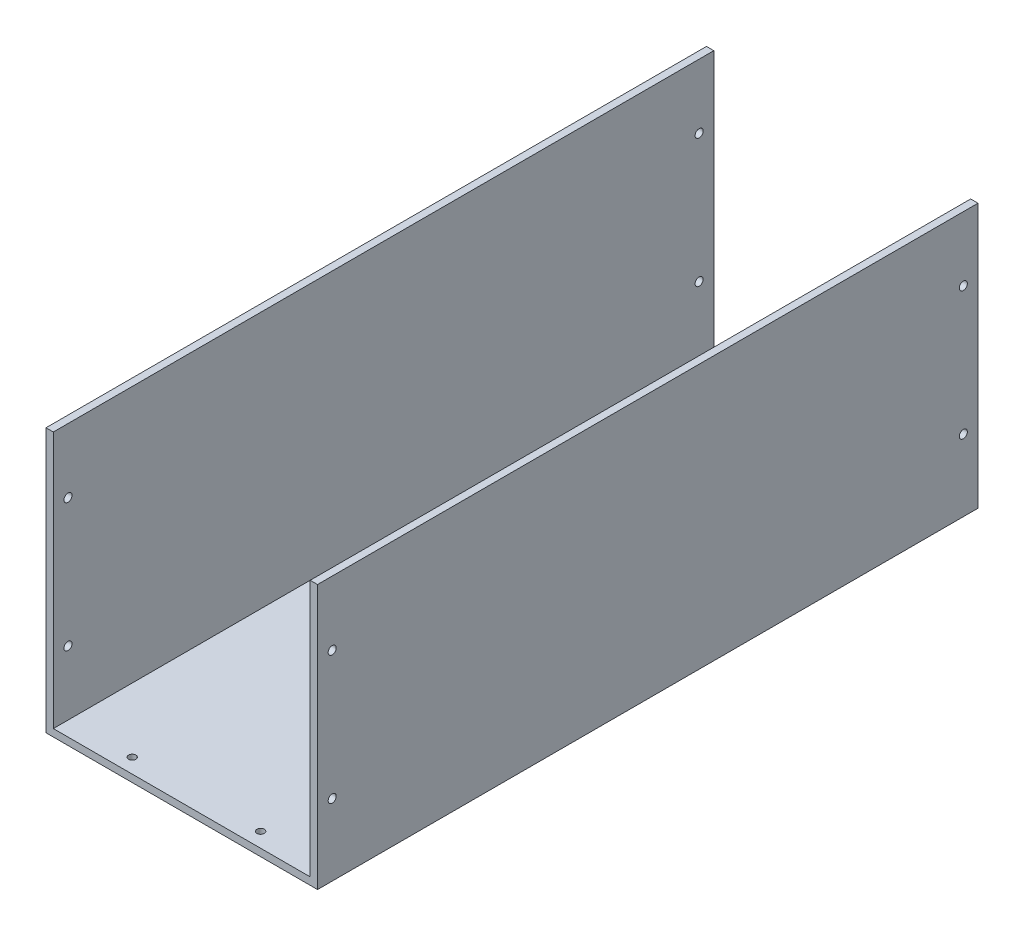
ISO-10303-21;
HEADER;
FILE_DESCRIPTION(('STEP AP214'),'2;1');
FILE_NAME('part.step','',(''),(''),'','','');
FILE_SCHEMA(('AUTOMOTIVE_DESIGN { 1 0 10303 214 1 1 1 1 }'));
ENDSEC;
DATA;
#1=APPLICATION_CONTEXT('core data for automotive mechanical design processes');
#2=APPLICATION_PROTOCOL_DEFINITION('international standard','automotive_design',2000,#1);
#3=PRODUCT_CONTEXT('',#1,'mechanical');
#4=PRODUCT('Part','Part','',(#3));
#5=PRODUCT_RELATED_PRODUCT_CATEGORY('part','',(#4));
#6=PRODUCT_DEFINITION_FORMATION('','',#4);
#7=PRODUCT_DEFINITION_CONTEXT('part definition',#1,'design');
#8=PRODUCT_DEFINITION('design','',#6,#7);
#9=PRODUCT_DEFINITION_SHAPE('','',#8);
#10=(LENGTH_UNIT() NAMED_UNIT(*) SI_UNIT(.MILLI.,.METRE.));
#11=(NAMED_UNIT(*) PLANE_ANGLE_UNIT() SI_UNIT($,.RADIAN.));
#12=(NAMED_UNIT(*) SI_UNIT($,.STERADIAN.) SOLID_ANGLE_UNIT());
#13=UNCERTAINTY_MEASURE_WITH_UNIT(LENGTH_MEASURE(1.E-05),#10,'distance_accuracy_value','');
#14=(GEOMETRIC_REPRESENTATION_CONTEXT(3) GLOBAL_UNCERTAINTY_ASSIGNED_CONTEXT((#13)) GLOBAL_UNIT_ASSIGNED_CONTEXT((#10,
#11,#12)) REPRESENTATION_CONTEXT('',''));
#15=CARTESIAN_POINT('',(0.,0.,0.));
#16=DIRECTION('',(0.,0.,1.));
#17=DIRECTION('',(1.,0.,0.));
#18=AXIS2_PLACEMENT_3D('',#15,#16,#17);
#19=CARTESIAN_POINT('',(-35.,0.,180.));
#20=DIRECTION('',(-1.,0.,0.));
#21=DIRECTION('',(0.,-1.,0.));
#22=AXIS2_PLACEMENT_3D('',#19,#20,#21);
#23=PLANE('',#22);
#24=CARTESIAN_POINT('',(-35.,52.5,176.));
#25=DIRECTION('',(-1.,0.,0.));
#26=DIRECTION('',(0.,-1.,0.));
#27=AXIS2_PLACEMENT_3D('',#24,#25,#26);
#28=CIRCLE('',#27,1.1);
#29=CARTESIAN_POINT('',(-35.,51.4,176.));
#30=VERTEX_POINT('',#29);
#31=EDGE_CURVE('E195',#30,#30,#28,.F.);
#32=ORIENTED_EDGE('',*,*,#31,.F.);
#33=EDGE_LOOP('',(#32));
#34=FACE_BOUND('',#33,.T.);
#35=CARTESIAN_POINT('',(-35.,17.5,176.));
#36=DIRECTION('',(-1.,0.,0.));
#37=DIRECTION('',(0.,-1.,0.));
#38=AXIS2_PLACEMENT_3D('',#35,#36,#37);
#39=CIRCLE('',#38,1.1);
#40=CARTESIAN_POINT('',(-35.,16.4,176.));
#41=VERTEX_POINT('',#40);
#42=EDGE_CURVE('E171',#41,#41,#39,.F.);
#43=ORIENTED_EDGE('',*,*,#42,.F.);
#44=EDGE_LOOP('',(#43));
#45=FACE_BOUND('',#44,.T.);
#46=CARTESIAN_POINT('',(-35.,52.5,4.));
#47=DIRECTION('',(-1.,0.,0.));
#48=DIRECTION('',(0.,-1.,0.));
#49=AXIS2_PLACEMENT_3D('',#46,#47,#48);
#50=CIRCLE('',#49,1.1);
#51=CARTESIAN_POINT('',(-35.,51.4,4.));
#52=VERTEX_POINT('',#51);
#53=EDGE_CURVE('E139',#52,#52,#50,.T.);
#54=ORIENTED_EDGE('',*,*,#53,.T.);
#55=EDGE_LOOP('',(#54));
#56=FACE_BOUND('',#55,.T.);
#57=CARTESIAN_POINT('',(-35.,17.5,4.));
#58=DIRECTION('',(-1.,0.,0.));
#59=DIRECTION('',(0.,-1.,0.));
#60=AXIS2_PLACEMENT_3D('',#57,#58,#59);
#61=CIRCLE('',#60,1.1);
#62=CARTESIAN_POINT('',(-35.,16.4,4.));
#63=VERTEX_POINT('',#62);
#64=EDGE_CURVE('E165',#63,#63,#61,.T.);
#65=ORIENTED_EDGE('',*,*,#64,.T.);
#66=EDGE_LOOP('',(#65));
#67=FACE_BOUND('',#66,.T.);
#68=DIRECTION('',(0.,1.,0.));
#69=VECTOR('',#68,1.);
#70=CARTESIAN_POINT('',(-35.,0.,0.));
#71=LINE('',#70,#69);
#72=CARTESIAN_POINT('',(-35.,0.,0.));
#73=VERTEX_POINT('',#72);
#74=CARTESIAN_POINT('',(-35.,70.,0.));
#75=VERTEX_POINT('',#74);
#76=EDGE_CURVE('E135',#73,#75,#71,.T.);
#77=ORIENTED_EDGE('',*,*,#76,.T.);
#78=DIRECTION('',(0.,0.,-1.));
#79=VECTOR('',#78,1.);
#80=CARTESIAN_POINT('',(-35.,70.,180.));
#81=LINE('',#80,#79);
#82=CARTESIAN_POINT('',(-35.,70.,180.));
#83=VERTEX_POINT('',#82);
#84=EDGE_CURVE('E11',#83,#75,#81,.T.);
#85=ORIENTED_EDGE('',*,*,#84,.F.);
#86=DIRECTION('',(0.,1.,0.));
#87=VECTOR('',#86,1.);
#88=CARTESIAN_POINT('',(-35.,0.,180.));
#89=LINE('',#88,#87);
#90=CARTESIAN_POINT('',(-35.,0.,180.));
#91=VERTEX_POINT('',#90);
#92=EDGE_CURVE('E150',#91,#83,#89,.T.);
#93=ORIENTED_EDGE('',*,*,#92,.F.);
#94=DIRECTION('',(0.,0.,-1.));
#95=VECTOR('',#94,1.);
#96=CARTESIAN_POINT('',(-35.,0.,180.));
#97=LINE('',#96,#95);
#98=EDGE_CURVE('E131',#91,#73,#97,.T.);
#99=ORIENTED_EDGE('',*,*,#98,.T.);
#100=EDGE_LOOP('',(#77,#85,#93,#99));
#101=FACE_BOUND('',#100,.T.);
#102=ADVANCED_FACE('F37',(#34,#45,#56,#67,#101),#23,.F.);
#103=CARTESIAN_POINT('',(-37.,70.,180.));
#104=DIRECTION('',(0.,-1.,0.));
#105=DIRECTION('',(0.,0.,-1.));
#106=AXIS2_PLACEMENT_3D('',#103,#104,#105);
#107=PLANE('',#106);
#108=DIRECTION('',(-1.,0.,0.));
#109=VECTOR('',#108,1.);
#110=CARTESIAN_POINT('',(-37.,70.,0.));
#111=LINE('',#110,#109);
#112=CARTESIAN_POINT('',(-37.,70.,0.));
#113=VERTEX_POINT('',#112);
#114=EDGE_CURVE('E138',#75,#113,#111,.T.);
#115=ORIENTED_EDGE('',*,*,#114,.T.);
#116=DIRECTION('',(0.,0.,-1.));
#117=VECTOR('',#116,1.);
#118=CARTESIAN_POINT('',(-37.,70.,180.));
#119=LINE('',#118,#117);
#120=CARTESIAN_POINT('',(-37.,70.,180.));
#121=VERTEX_POINT('',#120);
#122=EDGE_CURVE('E46',#121,#113,#119,.T.);
#123=ORIENTED_EDGE('',*,*,#122,.F.);
#124=DIRECTION('',(-1.,0.,0.));
#125=VECTOR('',#124,1.);
#126=CARTESIAN_POINT('',(-37.,70.,180.));
#127=LINE('',#126,#125);
#128=EDGE_CURVE('E98',#83,#121,#127,.T.);
#129=ORIENTED_EDGE('',*,*,#128,.F.);
#130=ORIENTED_EDGE('',*,*,#84,.T.);
#131=EDGE_LOOP('',(#115,#123,#129,#130));
#132=FACE_BOUND('',#131,.T.);
#133=ADVANCED_FACE('F252',(#132),#107,.F.);
#134=CARTESIAN_POINT('',(-37.,-1.99999999999994,180.));
#135=DIRECTION('',(1.,0.,0.));
#136=DIRECTION('',(0.,1.,0.));
#137=AXIS2_PLACEMENT_3D('',#134,#135,#136);
#138=PLANE('',#137);
#139=CARTESIAN_POINT('',(-37.,52.5,176.));
#140=DIRECTION('',(-1.,0.,0.));
#141=DIRECTION('',(0.,0.,1.));
#142=AXIS2_PLACEMENT_3D('',#139,#140,#141);
#143=CIRCLE('',#142,1.1);
#144=CARTESIAN_POINT('',(-37.,52.5,177.1));
#145=VERTEX_POINT('',#144);
#146=EDGE_CURVE('E172',#145,#145,#143,.T.);
#147=ORIENTED_EDGE('',*,*,#146,.F.);
#148=EDGE_LOOP('',(#147));
#149=FACE_BOUND('',#148,.T.);
#150=CARTESIAN_POINT('',(-37.,17.5,176.));
#151=DIRECTION('',(-1.,0.,0.));
#152=DIRECTION('',(0.,0.,1.));
#153=AXIS2_PLACEMENT_3D('',#150,#151,#152);
#154=CIRCLE('',#153,1.1);
#155=CARTESIAN_POINT('',(-37.,17.5,177.1));
#156=VERTEX_POINT('',#155);
#157=EDGE_CURVE('E183',#156,#156,#154,.T.);
#158=ORIENTED_EDGE('',*,*,#157,.F.);
#159=EDGE_LOOP('',(#158));
#160=FACE_BOUND('',#159,.T.);
#161=CARTESIAN_POINT('',(-37.,52.5,4.));
#162=DIRECTION('',(1.,0.,0.));
#163=DIRECTION('',(0.,0.,-1.));
#164=AXIS2_PLACEMENT_3D('',#161,#162,#163);
#165=CIRCLE('',#164,1.1);
#166=CARTESIAN_POINT('',(-37.,52.5,2.9));
#167=VERTEX_POINT('',#166);
#168=EDGE_CURVE('E166',#167,#167,#165,.T.);
#169=ORIENTED_EDGE('',*,*,#168,.T.);
#170=EDGE_LOOP('',(#169));
#171=FACE_BOUND('',#170,.T.);
#172=CARTESIAN_POINT('',(-37.,17.5,4.));
#173=DIRECTION('',(1.,0.,0.));
#174=DIRECTION('',(0.,0.,-1.));
#175=AXIS2_PLACEMENT_3D('',#172,#173,#174);
#176=CIRCLE('',#175,1.1);
#177=CARTESIAN_POINT('',(-37.,17.5,2.9));
#178=VERTEX_POINT('',#177);
#179=EDGE_CURVE('E204',#178,#178,#176,.T.);
#180=ORIENTED_EDGE('',*,*,#179,.T.);
#181=EDGE_LOOP('',(#180));
#182=FACE_BOUND('',#181,.T.);
#183=DIRECTION('',(0.,-1.,0.));
#184=VECTOR('',#183,1.);
#185=CARTESIAN_POINT('',(-37.,-1.99999999999994,0.));
#186=LINE('',#185,#184);
#187=CARTESIAN_POINT('',(-37.,-1.99999999999994,0.));
#188=VERTEX_POINT('',#187);
#189=EDGE_CURVE('E141',#113,#188,#186,.T.);
#190=ORIENTED_EDGE('',*,*,#189,.T.);
#191=DIRECTION('',(0.,0.,-1.));
#192=VECTOR('',#191,1.);
#193=CARTESIAN_POINT('',(-37.,-1.99999999999994,180.));
#194=LINE('',#193,#192);
#195=CARTESIAN_POINT('',(-37.,-1.99999999999994,180.));
#196=VERTEX_POINT('',#195);
#197=EDGE_CURVE('E157',#196,#188,#194,.T.);
#198=ORIENTED_EDGE('',*,*,#197,.F.);
#199=DIRECTION('',(0.,-1.,0.));
#200=VECTOR('',#199,1.);
#201=CARTESIAN_POINT('',(-37.,-1.99999999999994,180.));
#202=LINE('',#201,#200);
#203=EDGE_CURVE('E215',#121,#196,#202,.T.);
#204=ORIENTED_EDGE('',*,*,#203,.F.);
#205=ORIENTED_EDGE('',*,*,#122,.T.);
#206=EDGE_LOOP('',(#190,#198,#204,#205));
#207=FACE_BOUND('',#206,.T.);
#208=ADVANCED_FACE('F257',(#149,#160,#171,#182,#207),#138,.F.);
#209=CARTESIAN_POINT('',(-37.,-1.99999999999994,180.));
#210=DIRECTION('',(0.,1.,0.));
#211=DIRECTION('',(0.,0.,1.));
#212=AXIS2_PLACEMENT_3D('',#209,#210,#211);
#213=PLANE('',#212);
#214=CARTESIAN_POINT('',(17.5,-1.99999999999995,4.));
#215=DIRECTION('',(0.,1.,0.));
#216=DIRECTION('',(1.,0.,0.));
#217=AXIS2_PLACEMENT_3D('',#214,#215,#216);
#218=CIRCLE('',#217,1.);
#219=CARTESIAN_POINT('',(18.5,-1.99999999999995,4.));
#220=VERTEX_POINT('',#219);
#221=EDGE_CURVE('E471',#220,#220,#218,.T.);
#222=ORIENTED_EDGE('',*,*,#221,.T.);
#223=EDGE_LOOP('',(#222));
#224=FACE_BOUND('',#223,.T.);
#225=CARTESIAN_POINT('',(-17.5,-1.99999999999995,176.));
#226=DIRECTION('',(0.,1.,0.));
#227=DIRECTION('',(1.,0.,0.));
#228=AXIS2_PLACEMENT_3D('',#225,#226,#227);
#229=CIRCLE('',#228,1.);
#230=CARTESIAN_POINT('',(-16.5,-1.99999999999995,176.));
#231=VERTEX_POINT('',#230);
#232=EDGE_CURVE('E474',#231,#231,#229,.T.);
#233=ORIENTED_EDGE('',*,*,#232,.T.);
#234=EDGE_LOOP('',(#233));
#235=FACE_BOUND('',#234,.T.);
#236=CARTESIAN_POINT('',(17.5,-1.99999999999995,176.));
#237=DIRECTION('',(0.,1.,0.));
#238=DIRECTION('',(-1.,0.,0.));
#239=AXIS2_PLACEMENT_3D('',#236,#237,#238);
#240=CIRCLE('',#239,1.);
#241=CARTESIAN_POINT('',(16.5,-1.99999999999995,176.));
#242=VERTEX_POINT('',#241);
#243=EDGE_CURVE('E483',#242,#242,#240,.T.);
#244=ORIENTED_EDGE('',*,*,#243,.T.);
#245=EDGE_LOOP('',(#244));
#246=FACE_BOUND('',#245,.T.);
#247=CARTESIAN_POINT('',(-17.5,-1.99999999999995,4.));
#248=DIRECTION('',(0.,1.,0.));
#249=DIRECTION('',(-1.,0.,0.));
#250=AXIS2_PLACEMENT_3D('',#247,#248,#249);
#251=CIRCLE('',#250,1.);
#252=CARTESIAN_POINT('',(-18.5,-1.99999999999995,4.));
#253=VERTEX_POINT('',#252);
#254=EDGE_CURVE('E193',#253,#253,#251,.T.);
#255=ORIENTED_EDGE('',*,*,#254,.T.);
#256=EDGE_LOOP('',(#255));
#257=FACE_BOUND('',#256,.T.);
#258=DIRECTION('',(1.,0.,0.));
#259=VECTOR('',#258,1.);
#260=CARTESIAN_POINT('',(-37.,-1.99999999999994,0.));
#261=LINE('',#260,#259);
#262=CARTESIAN_POINT('',(37.,-1.99999999999994,0.));
#263=VERTEX_POINT('',#262);
#264=EDGE_CURVE('E143',#188,#263,#261,.T.);
#265=ORIENTED_EDGE('',*,*,#264,.T.);
#266=DIRECTION('',(0.,0.,-1.));
#267=VECTOR('',#266,1.);
#268=CARTESIAN_POINT('',(37.,-1.99999999999994,180.));
#269=LINE('',#268,#267);
#270=CARTESIAN_POINT('',(37.,-1.99999999999994,180.));
#271=VERTEX_POINT('',#270);
#272=EDGE_CURVE('E154',#271,#263,#269,.T.);
#273=ORIENTED_EDGE('',*,*,#272,.F.);
#274=DIRECTION('',(1.,0.,0.));
#275=VECTOR('',#274,1.);
#276=CARTESIAN_POINT('',(-37.,-1.99999999999994,180.));
#277=LINE('',#276,#275);
#278=EDGE_CURVE('E217',#196,#271,#277,.T.);
#279=ORIENTED_EDGE('',*,*,#278,.F.);
#280=ORIENTED_EDGE('',*,*,#197,.T.);
#281=EDGE_LOOP('',(#265,#273,#279,#280));
#282=FACE_BOUND('',#281,.T.);
#283=ADVANCED_FACE('F223',(#224,#235,#246,#257,#282),#213,.F.);
#284=CARTESIAN_POINT('',(37.,-1.99999999999994,180.));
#285=DIRECTION('',(-1.,0.,0.));
#286=DIRECTION('',(0.,0.,1.));
#287=AXIS2_PLACEMENT_3D('',#284,#285,#286);
#288=PLANE('',#287);
#289=CARTESIAN_POINT('',(37.,52.5,176.));
#290=DIRECTION('',(-1.,0.,0.));
#291=DIRECTION('',(0.,0.,1.));
#292=AXIS2_PLACEMENT_3D('',#289,#290,#291);
#293=CIRCLE('',#292,1.1);
#294=CARTESIAN_POINT('',(37.,52.5,177.1));
#295=VERTEX_POINT('',#294);
#296=EDGE_CURVE('E178',#295,#295,#293,.T.);
#297=ORIENTED_EDGE('',*,*,#296,.T.);
#298=EDGE_LOOP('',(#297));
#299=FACE_BOUND('',#298,.T.);
#300=CARTESIAN_POINT('',(37.,17.5,176.));
#301=DIRECTION('',(-1.,0.,0.));
#302=DIRECTION('',(0.,0.,1.));
#303=AXIS2_PLACEMENT_3D('',#300,#301,#302);
#304=CIRCLE('',#303,1.1);
#305=CARTESIAN_POINT('',(37.,17.5,177.1));
#306=VERTEX_POINT('',#305);
#307=EDGE_CURVE('E191',#306,#306,#304,.T.);
#308=ORIENTED_EDGE('',*,*,#307,.T.);
#309=EDGE_LOOP('',(#308));
#310=FACE_BOUND('',#309,.T.);
#311=CARTESIAN_POINT('',(37.,52.5,4.));
#312=DIRECTION('',(1.,0.,0.));
#313=DIRECTION('',(0.,0.,-1.));
#314=AXIS2_PLACEMENT_3D('',#311,#312,#313);
#315=CIRCLE('',#314,1.1);
#316=CARTESIAN_POINT('',(37.,52.5,2.9));
#317=VERTEX_POINT('',#316);
#318=EDGE_CURVE('E201',#317,#317,#315,.T.);
#319=ORIENTED_EDGE('',*,*,#318,.F.);
#320=EDGE_LOOP('',(#319));
#321=FACE_BOUND('',#320,.T.);
#322=CARTESIAN_POINT('',(37.,17.5,4.));
#323=DIRECTION('',(1.,0.,0.));
#324=DIRECTION('',(0.,0.,-1.));
#325=AXIS2_PLACEMENT_3D('',#322,#323,#324);
#326=CIRCLE('',#325,1.1);
#327=CARTESIAN_POINT('',(37.,17.5,2.9));
#328=VERTEX_POINT('',#327);
#329=EDGE_CURVE('E198',#328,#328,#326,.T.);
#330=ORIENTED_EDGE('',*,*,#329,.F.);
#331=EDGE_LOOP('',(#330));
#332=FACE_BOUND('',#331,.T.);
#333=DIRECTION('',(0.,1.,0.));
#334=VECTOR('',#333,1.);
#335=CARTESIAN_POINT('',(37.,-1.99999999999994,0.));
#336=LINE('',#335,#334);
#337=CARTESIAN_POINT('',(37.,70.,0.));
#338=VERTEX_POINT('',#337);
#339=EDGE_CURVE('E145',#263,#338,#336,.T.);
#340=ORIENTED_EDGE('',*,*,#339,.T.);
#341=DIRECTION('',(0.,0.,-1.));
#342=VECTOR('',#341,1.);
#343=CARTESIAN_POINT('',(37.,70.,180.));
#344=LINE('',#343,#342);
#345=CARTESIAN_POINT('',(37.,70.,180.));
#346=VERTEX_POINT('',#345);
#347=EDGE_CURVE('E126',#346,#338,#344,.T.);
#348=ORIENTED_EDGE('',*,*,#347,.F.);
#349=DIRECTION('',(0.,1.,0.));
#350=VECTOR('',#349,1.);
#351=CARTESIAN_POINT('',(37.,-1.99999999999994,180.));
#352=LINE('',#351,#350);
#353=EDGE_CURVE('E117',#271,#346,#352,.T.);
#354=ORIENTED_EDGE('',*,*,#353,.F.);
#355=ORIENTED_EDGE('',*,*,#272,.T.);
#356=EDGE_LOOP('',(#340,#348,#354,#355));
#357=FACE_BOUND('',#356,.T.);
#358=ADVANCED_FACE('F227',(#299,#310,#321,#332,#357),#288,.F.);
#359=CARTESIAN_POINT('',(35.,70.,180.));
#360=DIRECTION('',(0.,-1.,0.));
#361=DIRECTION('',(0.,0.,-1.));
#362=AXIS2_PLACEMENT_3D('',#359,#360,#361);
#363=PLANE('',#362);
#364=DIRECTION('',(-1.,0.,0.));
#365=VECTOR('',#364,1.);
#366=CARTESIAN_POINT('',(35.,70.,0.));
#367=LINE('',#366,#365);
#368=CARTESIAN_POINT('',(35.,70.,0.));
#369=VERTEX_POINT('',#368);
#370=EDGE_CURVE('E125',#338,#369,#367,.T.);
#371=ORIENTED_EDGE('',*,*,#370,.T.);
#372=DIRECTION('',(0.,0.,-1.));
#373=VECTOR('',#372,1.);
#374=CARTESIAN_POINT('',(35.,70.,180.));
#375=LINE('',#374,#373);
#376=CARTESIAN_POINT('',(35.,70.,180.));
#377=VERTEX_POINT('',#376);
#378=EDGE_CURVE('E122',#377,#369,#375,.T.);
#379=ORIENTED_EDGE('',*,*,#378,.F.);
#380=DIRECTION('',(-1.,0.,0.));
#381=VECTOR('',#380,1.);
#382=CARTESIAN_POINT('',(35.,70.,180.));
#383=LINE('',#382,#381);
#384=EDGE_CURVE('E111',#346,#377,#383,.T.);
#385=ORIENTED_EDGE('',*,*,#384,.F.);
#386=ORIENTED_EDGE('',*,*,#347,.T.);
#387=EDGE_LOOP('',(#371,#379,#385,#386));
#388=FACE_BOUND('',#387,.T.);
#389=ADVANCED_FACE('F123',(#388),#363,.F.);
#390=CARTESIAN_POINT('',(35.,0.,180.));
#391=DIRECTION('',(1.,0.,0.));
#392=DIRECTION('',(0.,0.,-1.));
#393=AXIS2_PLACEMENT_3D('',#390,#391,#392);
#394=PLANE('',#393);
#395=CARTESIAN_POINT('',(35.,52.5,176.));
#396=DIRECTION('',(1.,0.,0.));
#397=DIRECTION('',(0.,0.,-1.));
#398=AXIS2_PLACEMENT_3D('',#395,#396,#397);
#399=CIRCLE('',#398,1.1);
#400=CARTESIAN_POINT('',(35.,52.5,174.9));
#401=VERTEX_POINT('',#400);
#402=EDGE_CURVE('E40',#401,#401,#399,.F.);
#403=ORIENTED_EDGE('',*,*,#402,.F.);
#404=EDGE_LOOP('',(#403));
#405=FACE_BOUND('',#404,.T.);
#406=CARTESIAN_POINT('',(35.,17.5,176.));
#407=DIRECTION('',(1.,0.,0.));
#408=DIRECTION('',(0.,0.,-1.));
#409=AXIS2_PLACEMENT_3D('',#406,#407,#408);
#410=CIRCLE('',#409,1.1);
#411=CARTESIAN_POINT('',(35.,17.5,174.9));
#412=VERTEX_POINT('',#411);
#413=EDGE_CURVE('E169',#412,#412,#410,.F.);
#414=ORIENTED_EDGE('',*,*,#413,.F.);
#415=EDGE_LOOP('',(#414));
#416=FACE_BOUND('',#415,.T.);
#417=CARTESIAN_POINT('',(35.,52.5,4.));
#418=DIRECTION('',(1.,0.,0.));
#419=DIRECTION('',(0.,0.,-1.));
#420=AXIS2_PLACEMENT_3D('',#417,#418,#419);
#421=CIRCLE('',#420,1.1);
#422=CARTESIAN_POINT('',(35.,52.5,2.9));
#423=VERTEX_POINT('',#422);
#424=EDGE_CURVE('E167',#423,#423,#421,.T.);
#425=ORIENTED_EDGE('',*,*,#424,.T.);
#426=EDGE_LOOP('',(#425));
#427=FACE_BOUND('',#426,.T.);
#428=CARTESIAN_POINT('',(35.,17.5,4.));
#429=DIRECTION('',(1.,0.,0.));
#430=DIRECTION('',(0.,0.,-1.));
#431=AXIS2_PLACEMENT_3D('',#428,#429,#430);
#432=CIRCLE('',#431,1.1);
#433=CARTESIAN_POINT('',(35.,17.5,2.9));
#434=VERTEX_POINT('',#433);
#435=EDGE_CURVE('E162',#434,#434,#432,.T.);
#436=ORIENTED_EDGE('',*,*,#435,.T.);
#437=EDGE_LOOP('',(#436));
#438=FACE_BOUND('',#437,.T.);
#439=DIRECTION('',(0.,-1.,0.));
#440=VECTOR('',#439,1.);
#441=CARTESIAN_POINT('',(35.,0.,0.));
#442=LINE('',#441,#440);
#443=CARTESIAN_POINT('',(35.,0.,0.));
#444=VERTEX_POINT('',#443);
#445=EDGE_CURVE('E84',#369,#444,#442,.T.);
#446=ORIENTED_EDGE('',*,*,#445,.T.);
#447=DIRECTION('',(0.,0.,-1.));
#448=VECTOR('',#447,1.);
#449=CARTESIAN_POINT('',(35.,0.,180.));
#450=LINE('',#449,#448);
#451=CARTESIAN_POINT('',(35.,0.,180.));
#452=VERTEX_POINT('',#451);
#453=EDGE_CURVE('E127',#452,#444,#450,.T.);
#454=ORIENTED_EDGE('',*,*,#453,.F.);
#455=DIRECTION('',(0.,-1.,0.));
#456=VECTOR('',#455,1.);
#457=CARTESIAN_POINT('',(35.,0.,180.));
#458=LINE('',#457,#456);
#459=EDGE_CURVE('E115',#377,#452,#458,.T.);
#460=ORIENTED_EDGE('',*,*,#459,.F.);
#461=ORIENTED_EDGE('',*,*,#378,.T.);
#462=EDGE_LOOP('',(#446,#454,#460,#461));
#463=FACE_BOUND('',#462,.T.);
#464=ADVANCED_FACE('F129',(#405,#416,#427,#438,#463),#394,.F.);
#465=CARTESIAN_POINT('',(-35.,0.,180.));
#466=DIRECTION('',(0.,-1.,0.));
#467=DIRECTION('',(1.,0.,0.));
#468=AXIS2_PLACEMENT_3D('',#465,#466,#467);
#469=PLANE('',#468);
#470=CARTESIAN_POINT('',(17.5,0.,4.));
#471=DIRECTION('',(0.,1.,0.));
#472=DIRECTION('',(1.,0.,0.));
#473=AXIS2_PLACEMENT_3D('',#470,#471,#472);
#474=CIRCLE('',#473,1.);
#475=CARTESIAN_POINT('',(18.5,0.,4.));
#476=VERTEX_POINT('',#475);
#477=EDGE_CURVE('E473',#476,#476,#474,.T.);
#478=ORIENTED_EDGE('',*,*,#477,.F.);
#479=EDGE_LOOP('',(#478));
#480=FACE_BOUND('',#479,.T.);
#481=CARTESIAN_POINT('',(-17.5,0.,176.));
#482=DIRECTION('',(0.,1.,0.));
#483=DIRECTION('',(1.,0.,0.));
#484=AXIS2_PLACEMENT_3D('',#481,#482,#483);
#485=CIRCLE('',#484,1.);
#486=CARTESIAN_POINT('',(-16.5,0.,176.));
#487=VERTEX_POINT('',#486);
#488=EDGE_CURVE('E478',#487,#487,#485,.T.);
#489=ORIENTED_EDGE('',*,*,#488,.F.);
#490=EDGE_LOOP('',(#489));
#491=FACE_BOUND('',#490,.T.);
#492=CARTESIAN_POINT('',(17.5,0.,176.));
#493=DIRECTION('',(0.,1.,0.));
#494=DIRECTION('',(-1.,0.,0.));
#495=AXIS2_PLACEMENT_3D('',#492,#493,#494);
#496=CIRCLE('',#495,1.);
#497=CARTESIAN_POINT('',(16.5,0.,176.));
#498=VERTEX_POINT('',#497);
#499=EDGE_CURVE('E494',#498,#498,#496,.T.);
#500=ORIENTED_EDGE('',*,*,#499,.F.);
#501=EDGE_LOOP('',(#500));
#502=FACE_BOUND('',#501,.T.);
#503=CARTESIAN_POINT('',(-17.5,0.,4.));
#504=DIRECTION('',(0.,1.,0.));
#505=DIRECTION('',(-1.,0.,0.));
#506=AXIS2_PLACEMENT_3D('',#503,#504,#505);
#507=CIRCLE('',#506,1.);
#508=CARTESIAN_POINT('',(-18.5,0.,4.));
#509=VERTEX_POINT('',#508);
#510=EDGE_CURVE('E186',#509,#509,#507,.T.);
#511=ORIENTED_EDGE('',*,*,#510,.F.);
#512=EDGE_LOOP('',(#511));
#513=FACE_BOUND('',#512,.T.);
#514=DIRECTION('',(-1.,0.,0.));
#515=VECTOR('',#514,1.);
#516=CARTESIAN_POINT('',(-35.,0.,0.));
#517=LINE('',#516,#515);
#518=EDGE_CURVE('E90',#444,#73,#517,.T.);
#519=ORIENTED_EDGE('',*,*,#518,.T.);
#520=ORIENTED_EDGE('',*,*,#98,.F.);
#521=DIRECTION('',(-1.,0.,0.));
#522=VECTOR('',#521,1.);
#523=CARTESIAN_POINT('',(-35.,0.,180.));
#524=LINE('',#523,#522);
#525=EDGE_CURVE('E55',#452,#91,#524,.T.);
#526=ORIENTED_EDGE('',*,*,#525,.F.);
#527=ORIENTED_EDGE('',*,*,#453,.T.);
#528=EDGE_LOOP('',(#519,#520,#526,#527));
#529=FACE_BOUND('',#528,.T.);
#530=ADVANCED_FACE('F235',(#480,#491,#502,#513,#529),#469,.F.);
#531=CARTESIAN_POINT('',(0.,0.,180.));
#532=DIRECTION('',(0.,0.,-1.));
#533=DIRECTION('',(-1.,0.,0.));
#534=AXIS2_PLACEMENT_3D('',#531,#532,#533);
#535=PLANE('',#534);
#536=ORIENTED_EDGE('',*,*,#92,.T.);
#537=ORIENTED_EDGE('',*,*,#128,.T.);
#538=ORIENTED_EDGE('',*,*,#203,.T.);
#539=ORIENTED_EDGE('',*,*,#278,.T.);
#540=ORIENTED_EDGE('',*,*,#353,.T.);
#541=ORIENTED_EDGE('',*,*,#384,.T.);
#542=ORIENTED_EDGE('',*,*,#459,.T.);
#543=ORIENTED_EDGE('',*,*,#525,.T.);
#544=EDGE_LOOP('',(#536,#537,#538,#539,#540,#541,#542,#543));
#545=FACE_BOUND('',#544,.T.);
#546=ADVANCED_FACE('F113',(#545),#535,.F.);
#547=CARTESIAN_POINT('',(0.,0.,0.));
#548=DIRECTION('',(0.,0.,-1.));
#549=DIRECTION('',(-1.,0.,0.));
#550=AXIS2_PLACEMENT_3D('',#547,#548,#549);
#551=PLANE('',#550);
#552=ORIENTED_EDGE('',*,*,#76,.F.);
#553=ORIENTED_EDGE('',*,*,#518,.F.);
#554=ORIENTED_EDGE('',*,*,#445,.F.);
#555=ORIENTED_EDGE('',*,*,#370,.F.);
#556=ORIENTED_EDGE('',*,*,#339,.F.);
#557=ORIENTED_EDGE('',*,*,#264,.F.);
#558=ORIENTED_EDGE('',*,*,#189,.F.);
#559=ORIENTED_EDGE('',*,*,#114,.F.);
#560=EDGE_LOOP('',(#552,#553,#554,#555,#556,#557,#558,#559));
#561=FACE_BOUND('',#560,.T.);
#562=ADVANCED_FACE('F230',(#561),#551,.T.);
#563=CARTESIAN_POINT('',(-37.,17.5,4.));
#564=DIRECTION('',(1.,0.,0.));
#565=DIRECTION('',(0.,0.,-1.));
#566=AXIS2_PLACEMENT_3D('',#563,#564,#565);
#567=CYLINDRICAL_SURFACE('',#566,1.1);
#568=ORIENTED_EDGE('',*,*,#329,.T.);
#569=EDGE_LOOP('',(#568));
#570=FACE_BOUND('',#569,.T.);
#571=ORIENTED_EDGE('',*,*,#435,.F.);
#572=EDGE_LOOP('',(#571));
#573=FACE_BOUND('',#572,.T.);
#574=ADVANCED_FACE('F272',(#570,#573),#567,.F.);
#575=CARTESIAN_POINT('',(-37.,52.5,4.));
#576=DIRECTION('',(1.,0.,0.));
#577=DIRECTION('',(0.,0.,-1.));
#578=AXIS2_PLACEMENT_3D('',#575,#576,#577);
#579=CYLINDRICAL_SURFACE('',#578,1.1);
#580=ORIENTED_EDGE('',*,*,#318,.T.);
#581=EDGE_LOOP('',(#580));
#582=FACE_BOUND('',#581,.T.);
#583=ORIENTED_EDGE('',*,*,#424,.F.);
#584=EDGE_LOOP('',(#583));
#585=FACE_BOUND('',#584,.T.);
#586=ADVANCED_FACE('F269',(#582,#585),#579,.F.);
#587=ORIENTED_EDGE('',*,*,#179,.F.);
#588=EDGE_LOOP('',(#587));
#589=FACE_BOUND('',#588,.T.);
#590=ORIENTED_EDGE('',*,*,#64,.F.);
#591=EDGE_LOOP('',(#590));
#592=FACE_BOUND('',#591,.T.);
#593=ADVANCED_FACE('F266',(#589,#592),#567,.F.);
#594=ORIENTED_EDGE('',*,*,#168,.F.);
#595=EDGE_LOOP('',(#594));
#596=FACE_BOUND('',#595,.T.);
#597=ORIENTED_EDGE('',*,*,#53,.F.);
#598=EDGE_LOOP('',(#597));
#599=FACE_BOUND('',#598,.T.);
#600=ADVANCED_FACE('F268',(#596,#599),#579,.F.);
#601=CARTESIAN_POINT('',(-37.,17.5,176.));
#602=DIRECTION('',(1.,0.,0.));
#603=DIRECTION('',(0.,0.,-1.));
#604=AXIS2_PLACEMENT_3D('',#601,#602,#603);
#605=CYLINDRICAL_SURFACE('',#604,1.1);
#606=ORIENTED_EDGE('',*,*,#307,.F.);
#607=EDGE_LOOP('',(#606));
#608=FACE_BOUND('',#607,.T.);
#609=ORIENTED_EDGE('',*,*,#413,.T.);
#610=EDGE_LOOP('',(#609));
#611=FACE_BOUND('',#610,.T.);
#612=ADVANCED_FACE('F277',(#608,#611),#605,.F.);
#613=CARTESIAN_POINT('',(-37.,52.5,176.));
#614=DIRECTION('',(1.,0.,0.));
#615=DIRECTION('',(0.,0.,-1.));
#616=AXIS2_PLACEMENT_3D('',#613,#614,#615);
#617=CYLINDRICAL_SURFACE('',#616,1.1);
#618=ORIENTED_EDGE('',*,*,#296,.F.);
#619=EDGE_LOOP('',(#618));
#620=FACE_BOUND('',#619,.T.);
#621=ORIENTED_EDGE('',*,*,#402,.T.);
#622=EDGE_LOOP('',(#621));
#623=FACE_BOUND('',#622,.T.);
#624=ADVANCED_FACE('F320',(#620,#623),#617,.F.);
#625=ORIENTED_EDGE('',*,*,#157,.T.);
#626=EDGE_LOOP('',(#625));
#627=FACE_BOUND('',#626,.T.);
#628=ORIENTED_EDGE('',*,*,#42,.T.);
#629=EDGE_LOOP('',(#628));
#630=FACE_BOUND('',#629,.T.);
#631=ADVANCED_FACE('F316',(#627,#630),#605,.F.);
#632=ORIENTED_EDGE('',*,*,#146,.T.);
#633=EDGE_LOOP('',(#632));
#634=FACE_BOUND('',#633,.T.);
#635=ORIENTED_EDGE('',*,*,#31,.T.);
#636=EDGE_LOOP('',(#635));
#637=FACE_BOUND('',#636,.T.);
#638=ADVANCED_FACE('F319',(#634,#637),#617,.F.);
#639=CARTESIAN_POINT('',(-17.5,-1.99999999999995,4.));
#640=DIRECTION('',(0.,1.,0.));
#641=DIRECTION('',(-1.,0.,0.));
#642=AXIS2_PLACEMENT_3D('',#639,#640,#641);
#643=CYLINDRICAL_SURFACE('',#642,1.);
#644=ORIENTED_EDGE('',*,*,#254,.F.);
#645=EDGE_LOOP('',(#644));
#646=FACE_BOUND('',#645,.T.);
#647=ORIENTED_EDGE('',*,*,#510,.T.);
#648=EDGE_LOOP('',(#647));
#649=FACE_BOUND('',#648,.T.);
#650=ADVANCED_FACE('F326',(#646,#649),#643,.F.);
#651=CARTESIAN_POINT('',(17.5,-1.99999999999995,176.));
#652=DIRECTION('',(0.,1.,0.));
#653=DIRECTION('',(-1.,0.,0.));
#654=AXIS2_PLACEMENT_3D('',#651,#652,#653);
#655=CYLINDRICAL_SURFACE('',#654,1.);
#656=ORIENTED_EDGE('',*,*,#243,.F.);
#657=EDGE_LOOP('',(#656));
#658=FACE_BOUND('',#657,.T.);
#659=ORIENTED_EDGE('',*,*,#499,.T.);
#660=EDGE_LOOP('',(#659));
#661=FACE_BOUND('',#660,.T.);
#662=ADVANCED_FACE('F434',(#658,#661),#655,.F.);
#663=CARTESIAN_POINT('',(-17.5,-1.99999999999995,176.));
#664=DIRECTION('',(0.,1.,0.));
#665=DIRECTION('',(-1.,0.,0.));
#666=AXIS2_PLACEMENT_3D('',#663,#664,#665);
#667=CYLINDRICAL_SURFACE('',#666,1.);
#668=ORIENTED_EDGE('',*,*,#232,.F.);
#669=EDGE_LOOP('',(#668));
#670=FACE_BOUND('',#669,.T.);
#671=ORIENTED_EDGE('',*,*,#488,.T.);
#672=EDGE_LOOP('',(#671));
#673=FACE_BOUND('',#672,.T.);
#674=ADVANCED_FACE('F441',(#670,#673),#667,.F.);
#675=CARTESIAN_POINT('',(17.5,-1.99999999999995,4.));
#676=DIRECTION('',(0.,1.,0.));
#677=DIRECTION('',(-1.,0.,0.));
#678=AXIS2_PLACEMENT_3D('',#675,#676,#677);
#679=CYLINDRICAL_SURFACE('',#678,1.);
#680=ORIENTED_EDGE('',*,*,#221,.F.);
#681=EDGE_LOOP('',(#680));
#682=FACE_BOUND('',#681,.T.);
#683=ORIENTED_EDGE('',*,*,#477,.T.);
#684=EDGE_LOOP('',(#683));
#685=FACE_BOUND('',#684,.T.);
#686=ADVANCED_FACE('F449',(#682,#685),#679,.F.);
#687=CLOSED_SHELL('',(#102,#133,#208,#283,#358,#389,#464,#530,#546,#562,#574,#586,#593,#600,
#612,#624,#631,#638,#650,#662,#674,#686));
#688=MANIFOLD_SOLID_BREP('B2',#687);
#689=ADVANCED_BREP_SHAPE_REPRESENTATION('',(#18,#688),#14);
#690=SHAPE_DEFINITION_REPRESENTATION(#9,#689);
ENDSEC;
END-ISO-10303-21;
